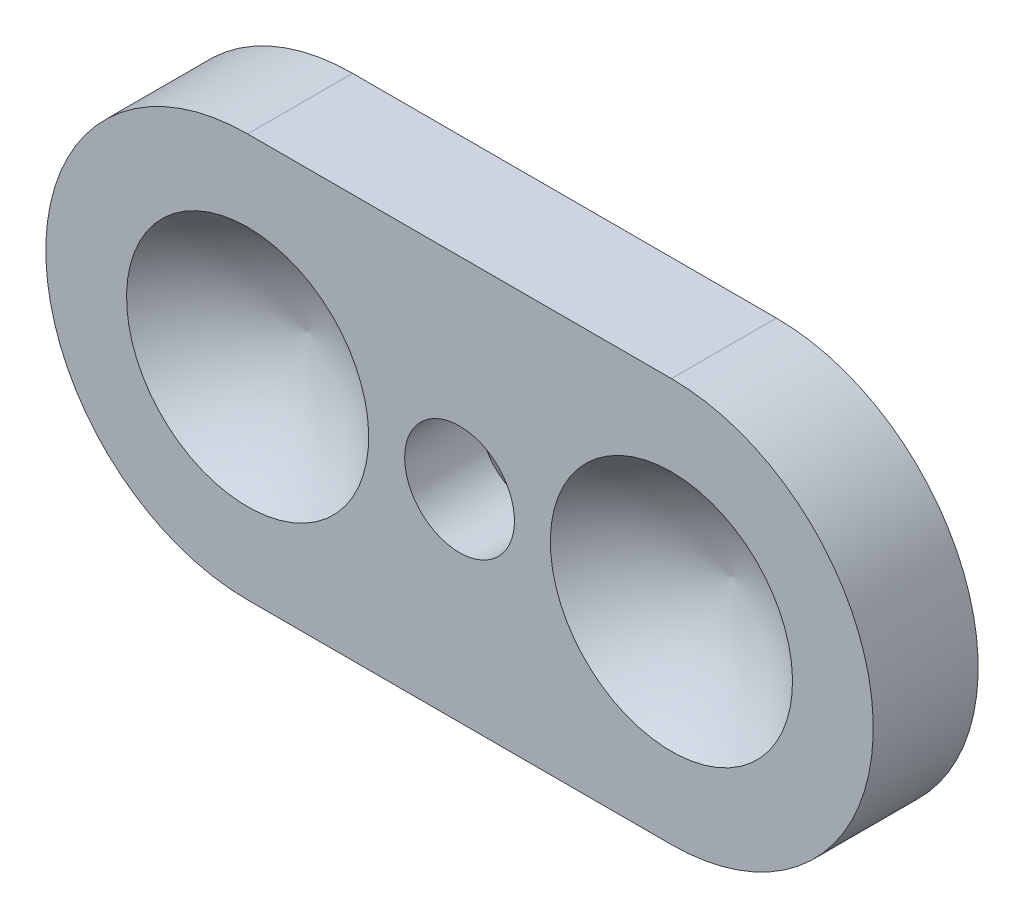
ISO-10303-21;
HEADER;
FILE_DESCRIPTION(('STEP AP214'),'2;1');
FILE_NAME('part.step','',(''),(''),'','','');
FILE_SCHEMA(('AUTOMOTIVE_DESIGN { 1 0 10303 214 1 1 1 1 }'));
ENDSEC;
DATA;
#1=APPLICATION_CONTEXT('core data for automotive mechanical design processes');
#2=APPLICATION_PROTOCOL_DEFINITION('international standard','automotive_design',2000,#1);
#3=PRODUCT_CONTEXT('',#1,'mechanical');
#4=PRODUCT('Part','Part','',(#3));
#5=PRODUCT_RELATED_PRODUCT_CATEGORY('part','',(#4));
#6=PRODUCT_DEFINITION_FORMATION('','',#4);
#7=PRODUCT_DEFINITION_CONTEXT('part definition',#1,'design');
#8=PRODUCT_DEFINITION('design','',#6,#7);
#9=PRODUCT_DEFINITION_SHAPE('','',#8);
#10=(LENGTH_UNIT() NAMED_UNIT(*) SI_UNIT(.MILLI.,.METRE.));
#11=(NAMED_UNIT(*) PLANE_ANGLE_UNIT() SI_UNIT($,.RADIAN.));
#12=(NAMED_UNIT(*) SI_UNIT($,.STERADIAN.) SOLID_ANGLE_UNIT());
#13=UNCERTAINTY_MEASURE_WITH_UNIT(LENGTH_MEASURE(1.E-05),#10,'distance_accuracy_value','');
#14=(GEOMETRIC_REPRESENTATION_CONTEXT(3) GLOBAL_UNCERTAINTY_ASSIGNED_CONTEXT((#13)) GLOBAL_UNIT_ASSIGNED_CONTEXT((#10,
#11,#12)) REPRESENTATION_CONTEXT('',''));
#15=CARTESIAN_POINT('',(0.,0.,0.));
#16=DIRECTION('',(0.,0.,1.));
#17=DIRECTION('',(1.,0.,0.));
#18=AXIS2_PLACEMENT_3D('',#15,#16,#17);
#19=CARTESIAN_POINT('',(-6.6675,0.,3.302));
#20=DIRECTION('',(0.,0.,-1.));
#21=DIRECTION('',(-1.,0.,0.));
#22=AXIS2_PLACEMENT_3D('',#19,#20,#21);
#23=CYLINDRICAL_SURFACE('',#22,6.35);
#24=CARTESIAN_POINT('',(-6.6675,0.,0.));
#25=DIRECTION('',(0.,0.,1.));
#26=DIRECTION('',(1.,0.,0.));
#27=AXIS2_PLACEMENT_3D('',#24,#25,#26);
#28=CIRCLE('',#27,6.35);
#29=CARTESIAN_POINT('',(-6.6675,6.35,0.));
#30=VERTEX_POINT('',#29);
#31=CARTESIAN_POINT('',(-6.6675,-6.35,0.));
#32=VERTEX_POINT('',#31);
#33=EDGE_CURVE('E134',#30,#32,#28,.T.);
#34=ORIENTED_EDGE('',*,*,#33,.T.);
#35=DIRECTION('',(0.,0.,-1.));
#36=VECTOR('',#35,1.);
#37=CARTESIAN_POINT('',(-6.6675,-6.35,3.302));
#38=LINE('',#37,#36);
#39=CARTESIAN_POINT('',(-6.6675,-6.35,3.302));
#40=VERTEX_POINT('',#39);
#41=EDGE_CURVE('E13',#40,#32,#38,.T.);
#42=ORIENTED_EDGE('',*,*,#41,.F.);
#43=CARTESIAN_POINT('',(-6.6675,0.,3.302));
#44=DIRECTION('',(0.,0.,1.));
#45=DIRECTION('',(1.,0.,0.));
#46=AXIS2_PLACEMENT_3D('',#43,#44,#45);
#47=CIRCLE('',#46,6.35);
#48=CARTESIAN_POINT('',(-6.6675,6.35,3.302));
#49=VERTEX_POINT('',#48);
#50=EDGE_CURVE('E150',#49,#40,#47,.T.);
#51=ORIENTED_EDGE('',*,*,#50,.F.);
#52=DIRECTION('',(0.,0.,-1.));
#53=VECTOR('',#52,1.);
#54=CARTESIAN_POINT('',(-6.6675,6.35,3.302));
#55=LINE('',#54,#53);
#56=EDGE_CURVE('E136',#49,#30,#55,.T.);
#57=ORIENTED_EDGE('',*,*,#56,.T.);
#58=EDGE_LOOP('',(#34,#42,#51,#57));
#59=FACE_BOUND('',#58,.T.);
#60=ADVANCED_FACE('F53',(#59),#23,.T.);
#61=CARTESIAN_POINT('',(-6.6675,-6.35,3.302));
#62=DIRECTION('',(0.,1.,0.));
#63=DIRECTION('',(0.,0.,1.));
#64=AXIS2_PLACEMENT_3D('',#61,#62,#63);
#65=PLANE('',#64);
#66=DIRECTION('',(1.,0.,0.));
#67=VECTOR('',#66,1.);
#68=CARTESIAN_POINT('',(-6.6675,-6.35,0.));
#69=LINE('',#68,#67);
#70=CARTESIAN_POINT('',(6.6675,-6.35,0.));
#71=VERTEX_POINT('',#70);
#72=EDGE_CURVE('E138',#32,#71,#69,.T.);
#73=ORIENTED_EDGE('',*,*,#72,.T.);
#74=DIRECTION('',(0.,0.,-1.));
#75=VECTOR('',#74,1.);
#76=CARTESIAN_POINT('',(6.6675,-6.35,3.302));
#77=LINE('',#76,#75);
#78=CARTESIAN_POINT('',(6.6675,-6.35,3.302));
#79=VERTEX_POINT('',#78);
#80=EDGE_CURVE('E61',#79,#71,#77,.T.);
#81=ORIENTED_EDGE('',*,*,#80,.F.);
#82=DIRECTION('',(1.,0.,0.));
#83=VECTOR('',#82,1.);
#84=CARTESIAN_POINT('',(-6.6675,-6.35,3.302));
#85=LINE('',#84,#83);
#86=EDGE_CURVE('E100',#40,#79,#85,.T.);
#87=ORIENTED_EDGE('',*,*,#86,.F.);
#88=ORIENTED_EDGE('',*,*,#41,.T.);
#89=EDGE_LOOP('',(#73,#81,#87,#88));
#90=FACE_BOUND('',#89,.T.);
#91=ADVANCED_FACE('F125',(#90),#65,.F.);
#92=CARTESIAN_POINT('',(6.6675,0.,3.302));
#93=DIRECTION('',(0.,0.,-1.));
#94=DIRECTION('',(-1.,0.,0.));
#95=AXIS2_PLACEMENT_3D('',#92,#93,#94);
#96=CYLINDRICAL_SURFACE('',#95,6.35);
#97=CARTESIAN_POINT('',(6.6675,0.,0.));
#98=DIRECTION('',(0.,0.,1.));
#99=DIRECTION('',(1.,0.,0.));
#100=AXIS2_PLACEMENT_3D('',#97,#98,#99);
#101=CIRCLE('',#100,6.35);
#102=CARTESIAN_POINT('',(6.6675,6.35,0.));
#103=VERTEX_POINT('',#102);
#104=EDGE_CURVE('E87',#71,#103,#101,.T.);
#105=ORIENTED_EDGE('',*,*,#104,.T.);
#106=DIRECTION('',(0.,0.,-1.));
#107=VECTOR('',#106,1.);
#108=CARTESIAN_POINT('',(6.6675,6.35,3.302));
#109=LINE('',#108,#107);
#110=CARTESIAN_POINT('',(6.6675,6.35,3.302));
#111=VERTEX_POINT('',#110);
#112=EDGE_CURVE('E152',#111,#103,#109,.T.);
#113=ORIENTED_EDGE('',*,*,#112,.F.);
#114=CARTESIAN_POINT('',(6.6675,0.,3.302));
#115=DIRECTION('',(0.,0.,1.));
#116=DIRECTION('',(1.,0.,0.));
#117=AXIS2_PLACEMENT_3D('',#114,#115,#116);
#118=CIRCLE('',#117,6.35);
#119=EDGE_CURVE('E154',#79,#111,#118,.T.);
#120=ORIENTED_EDGE('',*,*,#119,.F.);
#121=ORIENTED_EDGE('',*,*,#80,.T.);
#122=EDGE_LOOP('',(#105,#113,#120,#121));
#123=FACE_BOUND('',#122,.T.);
#124=ADVANCED_FACE('F130',(#123),#96,.T.);
#125=CARTESIAN_POINT('',(-6.6675,6.35,3.302));
#126=DIRECTION('',(0.,-1.,0.));
#127=DIRECTION('',(0.,0.,-1.));
#128=AXIS2_PLACEMENT_3D('',#125,#126,#127);
#129=PLANE('',#128);
#130=DIRECTION('',(-1.,0.,0.));
#131=VECTOR('',#130,1.);
#132=CARTESIAN_POINT('',(-6.6675,6.35,0.));
#133=LINE('',#132,#131);
#134=EDGE_CURVE('E93',#103,#30,#133,.T.);
#135=ORIENTED_EDGE('',*,*,#134,.T.);
#136=ORIENTED_EDGE('',*,*,#56,.F.);
#137=DIRECTION('',(-1.,0.,0.));
#138=VECTOR('',#137,1.);
#139=CARTESIAN_POINT('',(-6.6675,6.35,3.302));
#140=LINE('',#139,#138);
#141=EDGE_CURVE('E69',#111,#49,#140,.T.);
#142=ORIENTED_EDGE('',*,*,#141,.F.);
#143=ORIENTED_EDGE('',*,*,#112,.T.);
#144=EDGE_LOOP('',(#135,#136,#142,#143));
#145=FACE_BOUND('',#144,.T.);
#146=ADVANCED_FACE('F162',(#145),#129,.F.);
#147=CARTESIAN_POINT('',(-6.6675,0.,3.302));
#148=DIRECTION('',(0.,0.,1.));
#149=DIRECTION('',(1.,0.,0.));
#150=AXIS2_PLACEMENT_3D('',#147,#148,#149);
#151=PLANE('',#150);
#152=CARTESIAN_POINT('',(0.,0.,3.302));
#153=DIRECTION('',(0.,0.,-1.));
#154=DIRECTION('',(-1.,0.,0.));
#155=AXIS2_PLACEMENT_3D('',#152,#153,#154);
#156=CIRCLE('',#155,1.7272);
#157=CARTESIAN_POINT('',(-1.7272,0.,3.302));
#158=VERTEX_POINT('',#157);
#159=EDGE_CURVE('E254',#158,#158,#156,.T.);
#160=ORIENTED_EDGE('',*,*,#159,.T.);
#161=EDGE_LOOP('',(#160));
#162=FACE_BOUND('',#161,.T.);
#163=CARTESIAN_POINT('',(-6.6675,0.,3.302));
#164=DIRECTION('',(0.,0.,1.));
#165=DIRECTION('',(0.,1.,0.));
#166=AXIS2_PLACEMENT_3D('',#163,#164,#165);
#167=CIRCLE('',#166,3.81);
#168=CARTESIAN_POINT('',(-6.6675,3.81,3.302));
#169=VERTEX_POINT('',#168);
#170=EDGE_CURVE('E143',#169,#169,#167,.T.);
#171=ORIENTED_EDGE('',*,*,#170,.F.);
#172=EDGE_LOOP('',(#171));
#173=FACE_BOUND('',#172,.T.);
#174=CARTESIAN_POINT('',(6.6675,0.,3.302));
#175=DIRECTION('',(0.,0.,-1.));
#176=DIRECTION('',(0.,1.,0.));
#177=AXIS2_PLACEMENT_3D('',#174,#175,#176);
#178=CIRCLE('',#177,3.81);
#179=CARTESIAN_POINT('',(6.6675,3.81,3.302));
#180=VERTEX_POINT('',#179);
#181=EDGE_CURVE('E139',#180,#180,#178,.T.);
#182=ORIENTED_EDGE('',*,*,#181,.T.);
#183=EDGE_LOOP('',(#182));
#184=FACE_BOUND('',#183,.T.);
#185=ORIENTED_EDGE('',*,*,#50,.T.);
#186=ORIENTED_EDGE('',*,*,#86,.T.);
#187=ORIENTED_EDGE('',*,*,#119,.T.);
#188=ORIENTED_EDGE('',*,*,#141,.T.);
#189=EDGE_LOOP('',(#185,#186,#187,#188));
#190=FACE_BOUND('',#189,.T.);
#191=ADVANCED_FACE('F156',(#162,#173,#184,#190),#151,.T.);
#192=CARTESIAN_POINT('',(-6.6675,0.,0.));
#193=DIRECTION('',(0.,0.,1.));
#194=DIRECTION('',(1.,0.,0.));
#195=AXIS2_PLACEMENT_3D('',#192,#193,#194);
#196=PLANE('',#195);
#197=CARTESIAN_POINT('',(0.,0.,0.));
#198=DIRECTION('',(0.,0.,-1.));
#199=DIRECTION('',(-1.,0.,0.));
#200=AXIS2_PLACEMENT_3D('',#197,#198,#199);
#201=CIRCLE('',#200,2.8575);
#202=CARTESIAN_POINT('',(-2.8575,0.,0.));
#203=VERTEX_POINT('',#202);
#204=EDGE_CURVE('E252',#203,#203,#201,.T.);
#205=ORIENTED_EDGE('',*,*,#204,.F.);
#206=EDGE_LOOP('',(#205));
#207=FACE_BOUND('',#206,.T.);
#208=ORIENTED_EDGE('',*,*,#33,.F.);
#209=ORIENTED_EDGE('',*,*,#134,.F.);
#210=ORIENTED_EDGE('',*,*,#104,.F.);
#211=ORIENTED_EDGE('',*,*,#72,.F.);
#212=EDGE_LOOP('',(#208,#209,#210,#211));
#213=FACE_BOUND('',#212,.T.);
#214=ADVANCED_FACE('F120',(#207,#213),#196,.F.);
#215=CARTESIAN_POINT('',(6.6675,-0.933626913651044,8.02675382730209));
#216=DIRECTION('',(-1.,0.,0.));
#217=DIRECTION('',(0.,1.,0.));
#218=AXIS2_PLACEMENT_3D('',#215,#216,#217);
#219=CIRCLE('',#218,6.69516952918447);
#220=TRIMMED_CURVE('',#219,(PARAMETER_VALUE(-1.43089254452211)),
(PARAMETER_VALUE(1.43089254452211)),.T.,.PARAMETER.);
#221=CARTESIAN_POINT('',(6.6675,0.,8.02675382730209));
#222=DIRECTION('',(0.,0.,-1.));
#223=AXIS1_PLACEMENT('',#221,#222);
#224=SURFACE_OF_REVOLUTION('',#220,#223);
#225=ORIENTED_EDGE('',*,*,#181,.F.);
#226=EDGE_LOOP('',(#225));
#227=FACE_BOUND('',#226,.T.);
#228=CARTESIAN_POINT('',(6.6675,0.,1.397));
#229=VERTEX_POINT('',#228);
#230=VERTEX_LOOP('',#229);
#231=FACE_BOUND('',#230,.T.);
#232=ADVANCED_FACE('F110',(#227,#231),#224,.F.);
#233=CARTESIAN_POINT('',(-6.6675,-0.933626913651044,8.02675382730209));
#234=DIRECTION('',(-1.,0.,0.));
#235=DIRECTION('',(0.,1.,0.));
#236=AXIS2_PLACEMENT_3D('',#233,#234,#235);
#237=CIRCLE('',#236,6.69516952918447);
#238=TRIMMED_CURVE('',#237,(PARAMETER_VALUE(-1.43089254452211)),
(PARAMETER_VALUE(1.43089254452211)),.T.,.PARAMETER.);
#239=CARTESIAN_POINT('',(-6.6675,0.,8.02675382730209));
#240=DIRECTION('',(0.,0.,-1.));
#241=AXIS1_PLACEMENT('',#239,#240);
#242=SURFACE_OF_REVOLUTION('',#238,#241);
#243=ORIENTED_EDGE('',*,*,#170,.T.);
#244=EDGE_LOOP('',(#243));
#245=FACE_BOUND('',#244,.T.);
#246=CARTESIAN_POINT('',(-6.6675,0.,1.397));
#247=VERTEX_POINT('',#246);
#248=VERTEX_LOOP('',#247);
#249=FACE_BOUND('',#248,.T.);
#250=ADVANCED_FACE('F107',(#245,#249),#242,.F.);
#251=CARTESIAN_POINT('',(0.,0.,0.));
#252=DIRECTION('',(0.,0.,-1.));
#253=DIRECTION('',(-1.,0.,0.));
#254=AXIS2_PLACEMENT_3D('',#251,#252,#253);
#255=CYLINDRICAL_SURFACE('',#254,1.7272);
#256=ORIENTED_EDGE('',*,*,#159,.F.);
#257=EDGE_LOOP('',(#256));
#258=FACE_BOUND('',#257,.T.);
#259=CARTESIAN_POINT('',(0.,0.,0.94843431311968));
#260=DIRECTION('',(0.,0.,-1.));
#261=DIRECTION('',(-1.,0.,0.));
#262=AXIS2_PLACEMENT_3D('',#259,#260,#261);
#263=CIRCLE('',#262,1.7272);
#264=CARTESIAN_POINT('',(-1.7272,0.,0.94843431311968));
#265=VERTEX_POINT('',#264);
#266=EDGE_CURVE('E250',#265,#265,#263,.T.);
#267=ORIENTED_EDGE('',*,*,#266,.T.);
#268=EDGE_LOOP('',(#267));
#269=FACE_BOUND('',#268,.T.);
#270=ADVANCED_FACE('F109',(#258,#269),#255,.F.);
#271=CARTESIAN_POINT('',(0.,0.,0.));
#272=DIRECTION('',(0.,0.,-1.));
#273=DIRECTION('',(-1.,0.,0.));
#274=AXIS2_PLACEMENT_3D('',#271,#272,#273);
#275=CONICAL_SURFACE('',#274,2.8575,0.872664625997165);
#276=ORIENTED_EDGE('',*,*,#266,.F.);
#277=EDGE_LOOP('',(#276));
#278=FACE_BOUND('',#277,.T.);
#279=ORIENTED_EDGE('',*,*,#204,.T.);
#280=EDGE_LOOP('',(#279));
#281=FACE_BOUND('',#280,.T.);
#282=ADVANCED_FACE('F117',(#278,#281),#275,.F.);
#283=CLOSED_SHELL('',(#60,#91,#124,#146,#191,#214,#232,#250,#270,#282));
#284=MANIFOLD_SOLID_BREP('B2',#283);
#285=ADVANCED_BREP_SHAPE_REPRESENTATION('',(#18,#284),#14);
#286=SHAPE_DEFINITION_REPRESENTATION(#9,#285);
ENDSEC;
END-ISO-10303-21;
